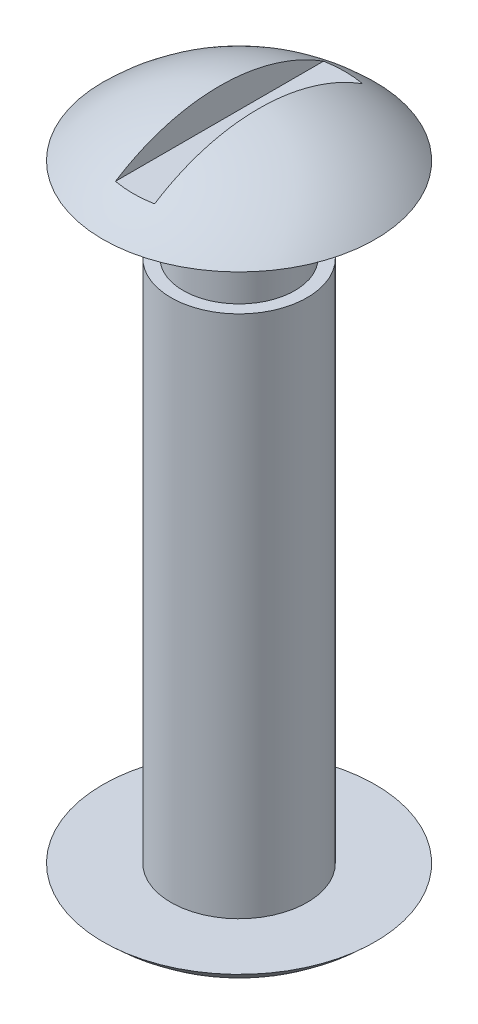
ISO-10303-21;
HEADER;
FILE_DESCRIPTION(('STEP AP214'),'2;1');
FILE_NAME('part.step','',(''),(''),'','','');
FILE_SCHEMA(('AUTOMOTIVE_DESIGN { 1 0 10303 214 1 1 1 1 }'));
ENDSEC;
DATA;
#1=APPLICATION_CONTEXT('core data for automotive mechanical design processes');
#2=APPLICATION_PROTOCOL_DEFINITION('international standard','automotive_design',2000,#1);
#3=PRODUCT_CONTEXT('',#1,'mechanical');
#4=PRODUCT('Part','Part','',(#3));
#5=PRODUCT_RELATED_PRODUCT_CATEGORY('part','',(#4));
#6=PRODUCT_DEFINITION_FORMATION('','',#4);
#7=PRODUCT_DEFINITION_CONTEXT('part definition',#1,'design');
#8=PRODUCT_DEFINITION('design','',#6,#7);
#9=PRODUCT_DEFINITION_SHAPE('','',#8);
#10=(LENGTH_UNIT() NAMED_UNIT(*) SI_UNIT(.MILLI.,.METRE.));
#11=(NAMED_UNIT(*) PLANE_ANGLE_UNIT() SI_UNIT($,.RADIAN.));
#12=(NAMED_UNIT(*) SI_UNIT($,.STERADIAN.) SOLID_ANGLE_UNIT());
#13=UNCERTAINTY_MEASURE_WITH_UNIT(LENGTH_MEASURE(1.E-05),#10,'distance_accuracy_value','');
#14=(GEOMETRIC_REPRESENTATION_CONTEXT(3) GLOBAL_UNCERTAINTY_ASSIGNED_CONTEXT((#13)) GLOBAL_UNIT_ASSIGNED_CONTEXT((#10,
#11,#12)) REPRESENTATION_CONTEXT('',''));
#15=CARTESIAN_POINT('',(0.,0.,0.));
#16=DIRECTION('',(0.,0.,1.));
#17=DIRECTION('',(1.,0.,0.));
#18=AXIS2_PLACEMENT_3D('',#15,#16,#17);
#19=CARTESIAN_POINT('',(2.4765,19.05,0.));
#20=DIRECTION('',(0.,-1.,0.));
#21=DIRECTION('',(1.,0.,0.));
#22=AXIS2_PLACEMENT_3D('',#19,#20,#21);
#23=PLANE('',#22);
#24=CARTESIAN_POINT('',(0.,19.05,0.));
#25=DIRECTION('',(0.,1.,0.));
#26=DIRECTION('',(-1.,0.,0.));
#27=AXIS2_PLACEMENT_3D('',#24,#25,#26);
#28=CIRCLE('',#27,2.032);
#29=CARTESIAN_POINT('',(-2.032,19.05,0.));
#30=VERTEX_POINT('',#29);
#31=EDGE_CURVE('E67',#30,#30,#28,.T.);
#32=ORIENTED_EDGE('',*,*,#31,.F.);
#33=EDGE_LOOP('',(#32));
#34=FACE_BOUND('',#33,.T.);
#35=CARTESIAN_POINT('',(0.,19.05,0.));
#36=DIRECTION('',(0.,1.,0.));
#37=DIRECTION('',(-1.,0.,0.));
#38=AXIS2_PLACEMENT_3D('',#35,#36,#37);
#39=CIRCLE('',#38,2.4765);
#40=CARTESIAN_POINT('',(-2.4765,19.05,0.));
#41=VERTEX_POINT('',#40);
#42=EDGE_CURVE('E71',#41,#41,#39,.T.);
#43=ORIENTED_EDGE('',*,*,#42,.T.);
#44=EDGE_LOOP('',(#43));
#45=FACE_BOUND('',#44,.T.);
#46=ADVANCED_FACE('F32',(#34,#45),#23,.F.);
#47=CARTESIAN_POINT('',(0.,24.1554,0.));
#48=DIRECTION('',(0.,1.,0.));
#49=DIRECTION('',(-1.,0.,0.));
#50=AXIS2_PLACEMENT_3D('',#47,#48,#49);
#51=CYLINDRICAL_SURFACE('',#50,2.4765);
#52=ORIENTED_EDGE('',*,*,#42,.F.);
#53=EDGE_LOOP('',(#52));
#54=FACE_BOUND('',#53,.T.);
#55=CARTESIAN_POINT('',(0.,0.,0.));
#56=DIRECTION('',(0.,1.,0.));
#57=DIRECTION('',(-1.,0.,0.));
#58=AXIS2_PLACEMENT_3D('',#55,#56,#57);
#59=CIRCLE('',#58,2.4765);
#60=CARTESIAN_POINT('',(-2.4765,0.,0.));
#61=VERTEX_POINT('',#60);
#62=EDGE_CURVE('E75',#61,#61,#59,.T.);
#63=ORIENTED_EDGE('',*,*,#62,.T.);
#64=EDGE_LOOP('',(#63));
#65=FACE_BOUND('',#64,.T.);
#66=ADVANCED_FACE('F95',(#54,#65),#51,.T.);
#67=CARTESIAN_POINT('',(2.4765,0.,0.));
#68=DIRECTION('',(0.,-1.,0.));
#69=DIRECTION('',(1.,0.,0.));
#70=AXIS2_PLACEMENT_3D('',#67,#68,#69);
#71=PLANE('',#70);
#72=ORIENTED_EDGE('',*,*,#62,.F.);
#73=EDGE_LOOP('',(#72));
#74=FACE_BOUND('',#73,.T.);
#75=CARTESIAN_POINT('',(0.,0.,0.));
#76=DIRECTION('',(0.,1.,0.));
#77=DIRECTION('',(-1.,0.,0.));
#78=AXIS2_PLACEMENT_3D('',#75,#76,#77);
#79=CIRCLE('',#78,4.95300000000001);
#80=CARTESIAN_POINT('',(-4.95300000000001,0.,0.));
#81=VERTEX_POINT('',#80);
#82=EDGE_CURVE('E78',#81,#81,#79,.T.);
#83=ORIENTED_EDGE('',*,*,#82,.T.);
#84=EDGE_LOOP('',(#83));
#85=FACE_BOUND('',#84,.T.);
#86=ADVANCED_FACE('F100',(#74,#85),#71,.F.);
#87=CARTESIAN_POINT('',(0.,5.02046875000001,0.));
#88=DIRECTION('',(0.,1.,0.));
#89=DIRECTION('',(-1.,0.,0.));
#90=AXIS2_PLACEMENT_3D('',#87,#88,#89);
#91=SPHERICAL_SURFACE('',#90,7.05246875000001);
#92=ORIENTED_EDGE('',*,*,#82,.F.);
#93=EDGE_LOOP('',(#92));
#94=FACE_BOUND('',#93,.T.);
#95=ADVANCED_FACE('F105',(#94),#91,.T.);
#96=CARTESIAN_POINT('',(0.,17.10293125,0.));
#97=DIRECTION('',(0.,1.,0.));
#98=DIRECTION('',(1.,0.,0.));
#99=AXIS2_PLACEMENT_3D('',#96,#97,#98);
#100=SPHERICAL_SURFACE('',#99,7.05246875000002);
#101=CARTESIAN_POINT('',(0.711200000000001,17.10293125,0.));
#102=DIRECTION('',(1.,0.,0.));
#103=DIRECTION('',(0.,1.,0.));
#104=AXIS2_PLACEMENT_3D('',#101,#102,#103);
#105=CIRCLE('',#104,7.01651694430554);
#106=CARTESIAN_POINT('',(0.7112,23.0124,-3.78281497333666));
#107=VERTEX_POINT('',#106);
#108=CARTESIAN_POINT('',(0.7112,23.0124,3.78281497333666));
#109=VERTEX_POINT('',#108);
#110=EDGE_CURVE('E65',#107,#109,#105,.T.);
#111=ORIENTED_EDGE('',*,*,#110,.T.);
#112=CARTESIAN_POINT('',(0.,23.0124,0.));
#113=DIRECTION('',(0.,-1.,0.));
#114=DIRECTION('',(0.,0.,-1.));
#115=AXIS2_PLACEMENT_3D('',#112,#113,#114);
#116=CIRCLE('',#115,3.84909009539917);
#117=CARTESIAN_POINT('',(-0.7112,23.0124,3.78281497333666));
#118=VERTEX_POINT('',#117);
#119=EDGE_CURVE('E11',#109,#118,#116,.T.);
#120=ORIENTED_EDGE('',*,*,#119,.T.);
#121=CARTESIAN_POINT('',(-0.711199999999999,17.10293125,0.));
#122=DIRECTION('',(-1.,0.,0.));
#123=DIRECTION('',(0.,-1.,0.));
#124=AXIS2_PLACEMENT_3D('',#121,#122,#123);
#125=CIRCLE('',#124,7.01651694430554);
#126=CARTESIAN_POINT('',(-0.7112,23.0124,-3.78281497333666));
#127=VERTEX_POINT('',#126);
#128=EDGE_CURVE('E35',#118,#127,#125,.T.);
#129=ORIENTED_EDGE('',*,*,#128,.T.);
#130=EDGE_CURVE('E41',#127,#107,#116,.T.);
#131=ORIENTED_EDGE('',*,*,#130,.T.);
#132=EDGE_LOOP('',(#111,#120,#129,#131));
#133=FACE_BOUND('',#132,.T.);
#134=CARTESIAN_POINT('',(0.,22.1234,0.));
#135=DIRECTION('',(0.,1.,0.));
#136=DIRECTION('',(-1.,0.,0.));
#137=AXIS2_PLACEMENT_3D('',#134,#135,#136);
#138=CIRCLE('',#137,4.95300000000001);
#139=CARTESIAN_POINT('',(-4.95300000000001,22.1234,0.));
#140=VERTEX_POINT('',#139);
#141=EDGE_CURVE('E81',#140,#140,#138,.T.);
#142=ORIENTED_EDGE('',*,*,#141,.T.);
#143=EDGE_LOOP('',(#142));
#144=FACE_BOUND('',#143,.T.);
#145=ADVANCED_FACE('F69',(#133,#144),#100,.T.);
#146=CARTESIAN_POINT('',(4.95300000000001,22.1234,0.));
#147=DIRECTION('',(0.,1.,0.));
#148=DIRECTION('',(-1.,0.,0.));
#149=AXIS2_PLACEMENT_3D('',#146,#147,#148);
#150=PLANE('',#149);
#151=ORIENTED_EDGE('',*,*,#141,.F.);
#152=EDGE_LOOP('',(#151));
#153=FACE_BOUND('',#152,.T.);
#154=CARTESIAN_POINT('',(0.,22.1234,0.));
#155=DIRECTION('',(0.,1.,0.));
#156=DIRECTION('',(-1.,0.,0.));
#157=AXIS2_PLACEMENT_3D('',#154,#155,#156);
#158=CIRCLE('',#157,2.032);
#159=CARTESIAN_POINT('',(-2.032,22.1234,0.));
#160=VERTEX_POINT('',#159);
#161=EDGE_CURVE('E84',#160,#160,#158,.T.);
#162=ORIENTED_EDGE('',*,*,#161,.T.);
#163=EDGE_LOOP('',(#162));
#164=FACE_BOUND('',#163,.T.);
#165=ADVANCED_FACE('F114',(#153,#164),#150,.F.);
#166=CARTESIAN_POINT('',(0.,24.1554,0.));
#167=DIRECTION('',(0.,1.,0.));
#168=DIRECTION('',(-1.,0.,0.));
#169=AXIS2_PLACEMENT_3D('',#166,#167,#168);
#170=CYLINDRICAL_SURFACE('',#169,2.032);
#171=ORIENTED_EDGE('',*,*,#161,.F.);
#172=EDGE_LOOP('',(#171));
#173=FACE_BOUND('',#172,.T.);
#174=ORIENTED_EDGE('',*,*,#31,.T.);
#175=EDGE_LOOP('',(#174));
#176=FACE_BOUND('',#175,.T.);
#177=ADVANCED_FACE('F91',(#173,#176),#170,.T.);
#178=CARTESIAN_POINT('',(-0.7112,24.2824,-4.95300000000001));
#179=DIRECTION('',(-1.,0.,0.));
#180=DIRECTION('',(0.,-1.,0.));
#181=AXIS2_PLACEMENT_3D('',#178,#179,#180);
#182=PLANE('',#181);
#183=DIRECTION('',(0.,0.,1.));
#184=VECTOR('',#183,1.);
#185=CARTESIAN_POINT('',(-0.7112,23.0124,-4.95300000000001));
#186=LINE('',#185,#184);
#187=EDGE_CURVE('E60',#127,#118,#186,.T.);
#188=ORIENTED_EDGE('',*,*,#187,.F.);
#189=ORIENTED_EDGE('',*,*,#128,.F.);
#190=EDGE_LOOP('',(#188,#189));
#191=FACE_BOUND('',#190,.T.);
#192=ADVANCED_FACE('F122',(#191),#182,.F.);
#193=CARTESIAN_POINT('',(0.7112,24.2824,-4.95300000000001));
#194=DIRECTION('',(1.,0.,0.));
#195=DIRECTION('',(0.,1.,0.));
#196=AXIS2_PLACEMENT_3D('',#193,#194,#195);
#197=PLANE('',#196);
#198=DIRECTION('',(0.,0.,1.));
#199=VECTOR('',#198,1.);
#200=CARTESIAN_POINT('',(0.7112,23.0124,-4.95300000000001));
#201=LINE('',#200,#199);
#202=EDGE_CURVE('E48',#107,#109,#201,.T.);
#203=ORIENTED_EDGE('',*,*,#202,.T.);
#204=ORIENTED_EDGE('',*,*,#110,.F.);
#205=EDGE_LOOP('',(#203,#204));
#206=FACE_BOUND('',#205,.T.);
#207=ADVANCED_FACE('F64',(#206),#197,.F.);
#208=CARTESIAN_POINT('',(-0.7112,23.0124,-4.95300000000001));
#209=DIRECTION('',(0.,-1.,0.));
#210=DIRECTION('',(0.,0.,-1.));
#211=AXIS2_PLACEMENT_3D('',#208,#209,#210);
#212=PLANE('',#211);
#213=ORIENTED_EDGE('',*,*,#202,.F.);
#214=ORIENTED_EDGE('',*,*,#130,.F.);
#215=ORIENTED_EDGE('',*,*,#187,.T.);
#216=ORIENTED_EDGE('',*,*,#119,.F.);
#217=EDGE_LOOP('',(#213,#214,#215,#216));
#218=FACE_BOUND('',#217,.T.);
#219=ADVANCED_FACE('F59',(#218),#212,.F.);
#220=CLOSED_SHELL('',(#46,#66,#86,#95,#145,#165,#177,#192,#207,#219));
#221=MANIFOLD_SOLID_BREP('B2',#220);
#222=ADVANCED_BREP_SHAPE_REPRESENTATION('',(#18,#221),#14);
#223=SHAPE_DEFINITION_REPRESENTATION(#9,#222);
ENDSEC;
END-ISO-10303-21;
